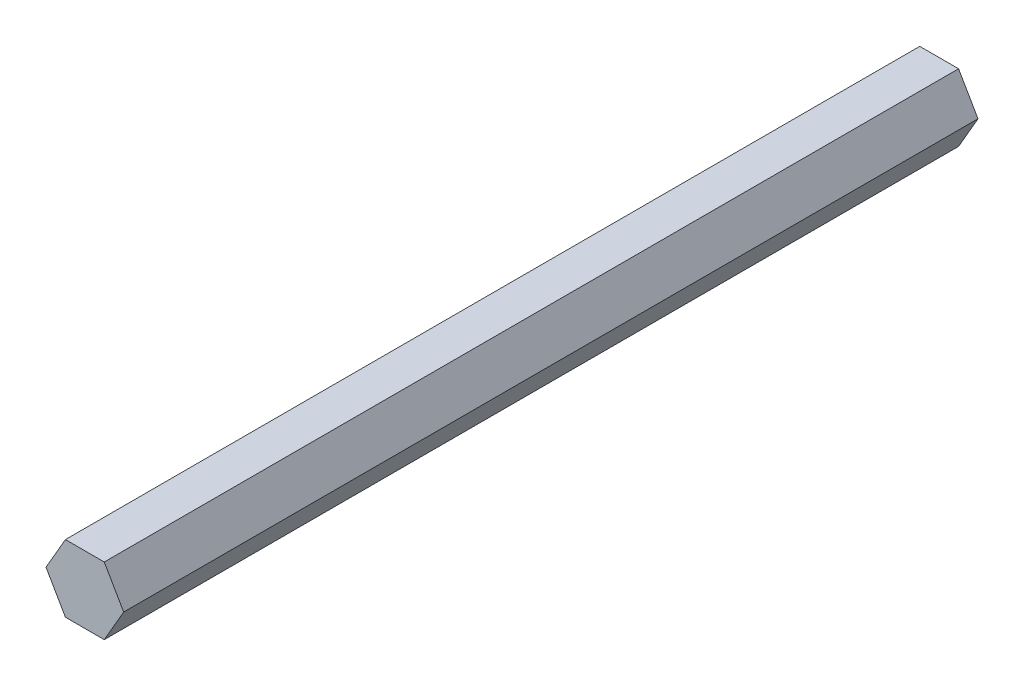
ISO-10303-21;
HEADER;
FILE_DESCRIPTION(('STEP AP214'),'2;1');
FILE_NAME('part.step','',(''),(''),'','','');
FILE_SCHEMA(('AUTOMOTIVE_DESIGN { 1 0 10303 214 1 1 1 1 }'));
ENDSEC;
DATA;
#1=APPLICATION_CONTEXT('core data for automotive mechanical design processes');
#2=APPLICATION_PROTOCOL_DEFINITION('international standard','automotive_design',2000,#1);
#3=PRODUCT_CONTEXT('',#1,'mechanical');
#4=PRODUCT('Part','Part','',(#3));
#5=PRODUCT_RELATED_PRODUCT_CATEGORY('part','',(#4));
#6=PRODUCT_DEFINITION_FORMATION('','',#4);
#7=PRODUCT_DEFINITION_CONTEXT('part definition',#1,'design');
#8=PRODUCT_DEFINITION('design','',#6,#7);
#9=PRODUCT_DEFINITION_SHAPE('','',#8);
#10=(LENGTH_UNIT() NAMED_UNIT(*) SI_UNIT(.MILLI.,.METRE.));
#11=(NAMED_UNIT(*) PLANE_ANGLE_UNIT() SI_UNIT($,.RADIAN.));
#12=(NAMED_UNIT(*) SI_UNIT($,.STERADIAN.) SOLID_ANGLE_UNIT());
#13=UNCERTAINTY_MEASURE_WITH_UNIT(LENGTH_MEASURE(1.E-05),#10,'distance_accuracy_value','');
#14=(GEOMETRIC_REPRESENTATION_CONTEXT(3) GLOBAL_UNCERTAINTY_ASSIGNED_CONTEXT((#13)) GLOBAL_UNIT_ASSIGNED_CONTEXT((#10,
#11,#12)) REPRESENTATION_CONTEXT('',''));
#15=CARTESIAN_POINT('',(0.,0.,0.));
#16=DIRECTION('',(0.,0.,1.));
#17=DIRECTION('',(1.,0.,0.));
#18=AXIS2_PLACEMENT_3D('',#15,#16,#17);
#19=CARTESIAN_POINT('',(0.866025403784457,-1.49999999999999,38.1));
#20=DIRECTION('',(-0.866025403784442,0.499999999999995,0.));
#21=DIRECTION('',(-0.499999999999995,-0.866025403784442,0.));
#22=AXIS2_PLACEMENT_3D('',#19,#20,#21);
#23=PLANE('',#22);
#24=DIRECTION('',(0.499999999999995,0.866025403784441,0.));
#25=VECTOR('',#24,1.);
#26=CARTESIAN_POINT('',(0.866025403784457,-1.49999999999999,0.));
#27=LINE('',#26,#25);
#28=CARTESIAN_POINT('',(0.866025403784457,-1.49999999999999,0.));
#29=VERTEX_POINT('',#28);
#30=CARTESIAN_POINT('',(1.73205080756888,0.,0.));
#31=VERTEX_POINT('',#30);
#32=EDGE_CURVE('E119',#29,#31,#27,.T.);
#33=ORIENTED_EDGE('',*,*,#32,.T.);
#34=DIRECTION('',(0.,0.,-1.));
#35=VECTOR('',#34,1.);
#36=CARTESIAN_POINT('',(1.73205080756888,0.,38.1));
#37=LINE('',#36,#35);
#38=CARTESIAN_POINT('',(1.73205080756888,0.,38.1));
#39=VERTEX_POINT('',#38);
#40=EDGE_CURVE('E11',#39,#31,#37,.T.);
#41=ORIENTED_EDGE('',*,*,#40,.F.);
#42=DIRECTION('',(0.499999999999995,0.866025403784441,0.));
#43=VECTOR('',#42,1.);
#44=CARTESIAN_POINT('',(0.866025403784457,-1.49999999999999,38.1));
#45=LINE('',#44,#43);
#46=CARTESIAN_POINT('',(0.866025403784457,-1.49999999999999,38.1));
#47=VERTEX_POINT('',#46);
#48=EDGE_CURVE('E129',#47,#39,#45,.T.);
#49=ORIENTED_EDGE('',*,*,#48,.F.);
#50=DIRECTION('',(0.,0.,-1.));
#51=VECTOR('',#50,1.);
#52=CARTESIAN_POINT('',(0.866025403784457,-1.49999999999999,38.1));
#53=LINE('',#52,#51);
#54=EDGE_CURVE('E115',#47,#29,#53,.T.);
#55=ORIENTED_EDGE('',*,*,#54,.T.);
#56=EDGE_LOOP('',(#33,#41,#49,#55));
#57=FACE_BOUND('',#56,.T.);
#58=ADVANCED_FACE('F35',(#57),#23,.F.);
#59=CARTESIAN_POINT('',(1.73205080756888,0.,38.1));
#60=DIRECTION('',(-0.866025403784438,-0.500000000000001,0.));
#61=DIRECTION('',(0.500000000000001,-0.866025403784438,0.));
#62=AXIS2_PLACEMENT_3D('',#59,#60,#61);
#63=PLANE('',#62);
#64=DIRECTION('',(-0.500000000000001,0.866025403784438,0.));
#65=VECTOR('',#64,1.);
#66=CARTESIAN_POINT('',(1.73205080756888,0.,0.));
#67=LINE('',#66,#65);
#68=CARTESIAN_POINT('',(0.866025403784436,1.5,0.));
#69=VERTEX_POINT('',#68);
#70=EDGE_CURVE('E122',#31,#69,#67,.T.);
#71=ORIENTED_EDGE('',*,*,#70,.T.);
#72=DIRECTION('',(0.,0.,-1.));
#73=VECTOR('',#72,1.);
#74=CARTESIAN_POINT('',(0.866025403784436,1.5,38.1));
#75=LINE('',#74,#73);
#76=CARTESIAN_POINT('',(0.866025403784436,1.5,38.1));
#77=VERTEX_POINT('',#76);
#78=EDGE_CURVE('E43',#77,#69,#75,.T.);
#79=ORIENTED_EDGE('',*,*,#78,.F.);
#80=DIRECTION('',(-0.500000000000001,0.866025403784438,0.));
#81=VECTOR('',#80,1.);
#82=CARTESIAN_POINT('',(1.73205080756888,0.,38.1));
#83=LINE('',#82,#81);
#84=EDGE_CURVE('E88',#39,#77,#83,.T.);
#85=ORIENTED_EDGE('',*,*,#84,.F.);
#86=ORIENTED_EDGE('',*,*,#40,.T.);
#87=EDGE_LOOP('',(#71,#79,#85,#86));
#88=FACE_BOUND('',#87,.T.);
#89=ADVANCED_FACE('F153',(#88),#63,.F.);
#90=CARTESIAN_POINT('',(0.866025403784436,1.5,38.1));
#91=DIRECTION('',(0.,-1.,0.));
#92=DIRECTION('',(1.,0.,0.));
#93=AXIS2_PLACEMENT_3D('',#90,#91,#92);
#94=PLANE('',#93);
#95=DIRECTION('',(-1.,0.,0.));
#96=VECTOR('',#95,1.);
#97=CARTESIAN_POINT('',(0.866025403784436,1.5,0.));
#98=LINE('',#97,#96);
#99=CARTESIAN_POINT('',(-0.866025403784446,1.5,0.));
#100=VERTEX_POINT('',#99);
#101=EDGE_CURVE('E124',#69,#100,#98,.T.);
#102=ORIENTED_EDGE('',*,*,#101,.T.);
#103=DIRECTION('',(0.,0.,-1.));
#104=VECTOR('',#103,1.);
#105=CARTESIAN_POINT('',(-0.866025403784446,1.5,38.1));
#106=LINE('',#105,#104);
#107=CARTESIAN_POINT('',(-0.866025403784446,1.5,38.1));
#108=VERTEX_POINT('',#107);
#109=EDGE_CURVE('E110',#108,#100,#106,.T.);
#110=ORIENTED_EDGE('',*,*,#109,.F.);
#111=DIRECTION('',(-1.,0.,0.));
#112=VECTOR('',#111,1.);
#113=CARTESIAN_POINT('',(0.866025403784436,1.5,38.1));
#114=LINE('',#113,#112);
#115=EDGE_CURVE('E101',#77,#108,#114,.T.);
#116=ORIENTED_EDGE('',*,*,#115,.F.);
#117=ORIENTED_EDGE('',*,*,#78,.T.);
#118=EDGE_LOOP('',(#102,#110,#116,#117));
#119=FACE_BOUND('',#118,.T.);
#120=ADVANCED_FACE('F135',(#119),#94,.F.);
#121=CARTESIAN_POINT('',(-0.866025403784446,1.5,38.1));
#122=DIRECTION('',(0.866025403784442,-0.499999999999995,0.));
#123=DIRECTION('',(0.499999999999995,0.866025403784442,0.));
#124=AXIS2_PLACEMENT_3D('',#121,#122,#123);
#125=PLANE('',#124);
#126=DIRECTION('',(-0.499999999999995,-0.866025403784442,0.));
#127=VECTOR('',#126,1.);
#128=CARTESIAN_POINT('',(-0.866025403784446,1.5,0.));
#129=LINE('',#128,#127);
#130=CARTESIAN_POINT('',(-1.73205080756888,0.,0.));
#131=VERTEX_POINT('',#130);
#132=EDGE_CURVE('E109',#100,#131,#129,.T.);
#133=ORIENTED_EDGE('',*,*,#132,.T.);
#134=DIRECTION('',(0.,0.,-1.));
#135=VECTOR('',#134,1.);
#136=CARTESIAN_POINT('',(-1.73205080756888,0.,38.1));
#137=LINE('',#136,#135);
#138=CARTESIAN_POINT('',(-1.73205080756888,0.,38.1));
#139=VERTEX_POINT('',#138);
#140=EDGE_CURVE('E106',#139,#131,#137,.T.);
#141=ORIENTED_EDGE('',*,*,#140,.F.);
#142=DIRECTION('',(-0.499999999999995,-0.866025403784442,0.));
#143=VECTOR('',#142,1.);
#144=CARTESIAN_POINT('',(-0.866025403784446,1.5,38.1));
#145=LINE('',#144,#143);
#146=EDGE_CURVE('E95',#108,#139,#145,.T.);
#147=ORIENTED_EDGE('',*,*,#146,.F.);
#148=ORIENTED_EDGE('',*,*,#109,.T.);
#149=EDGE_LOOP('',(#133,#141,#147,#148));
#150=FACE_BOUND('',#149,.T.);
#151=ADVANCED_FACE('F107',(#150),#125,.F.);
#152=CARTESIAN_POINT('',(-1.73205080756888,0.,38.1));
#153=DIRECTION('',(0.866025403784434,0.500000000000007,0.));
#154=DIRECTION('',(-0.500000000000007,0.866025403784435,0.));
#155=AXIS2_PLACEMENT_3D('',#152,#153,#154);
#156=PLANE('',#155);
#157=DIRECTION('',(0.500000000000007,-0.866025403784434,0.));
#158=VECTOR('',#157,1.);
#159=CARTESIAN_POINT('',(-1.73205080756888,0.,0.));
#160=LINE('',#159,#158);
#161=CARTESIAN_POINT('',(-0.866025403784425,-1.50000000000001,0.));
#162=VERTEX_POINT('',#161);
#163=EDGE_CURVE('E74',#131,#162,#160,.T.);
#164=ORIENTED_EDGE('',*,*,#163,.T.);
#165=DIRECTION('',(0.,0.,-1.));
#166=VECTOR('',#165,1.);
#167=CARTESIAN_POINT('',(-0.866025403784425,-1.50000000000001,38.1));
#168=LINE('',#167,#166);
#169=CARTESIAN_POINT('',(-0.866025403784425,-1.50000000000001,38.1));
#170=VERTEX_POINT('',#169);
#171=EDGE_CURVE('E111',#170,#162,#168,.T.);
#172=ORIENTED_EDGE('',*,*,#171,.F.);
#173=DIRECTION('',(0.500000000000007,-0.866025403784434,0.));
#174=VECTOR('',#173,1.);
#175=CARTESIAN_POINT('',(-1.73205080756888,0.,38.1));
#176=LINE('',#175,#174);
#177=EDGE_CURVE('E99',#139,#170,#176,.T.);
#178=ORIENTED_EDGE('',*,*,#177,.F.);
#179=ORIENTED_EDGE('',*,*,#140,.T.);
#180=EDGE_LOOP('',(#164,#172,#178,#179));
#181=FACE_BOUND('',#180,.T.);
#182=ADVANCED_FACE('F113',(#181),#156,.F.);
#183=CARTESIAN_POINT('',(-0.866025403784425,-1.50000000000001,38.1));
#184=DIRECTION('',(0.,1.,0.));
#185=DIRECTION('',(-1.,0.,0.));
#186=AXIS2_PLACEMENT_3D('',#183,#184,#185);
#187=PLANE('',#186);
#188=DIRECTION('',(1.,0.,0.));
#189=VECTOR('',#188,1.);
#190=CARTESIAN_POINT('',(-0.866025403784425,-1.50000000000001,0.));
#191=LINE('',#190,#189);
#192=EDGE_CURVE('E80',#162,#29,#191,.T.);
#193=ORIENTED_EDGE('',*,*,#192,.T.);
#194=ORIENTED_EDGE('',*,*,#54,.F.);
#195=DIRECTION('',(1.,0.,0.));
#196=VECTOR('',#195,1.);
#197=CARTESIAN_POINT('',(-0.866025403784425,-1.50000000000001,38.1));
#198=LINE('',#197,#196);
#199=EDGE_CURVE('E51',#170,#47,#198,.T.);
#200=ORIENTED_EDGE('',*,*,#199,.F.);
#201=ORIENTED_EDGE('',*,*,#171,.T.);
#202=EDGE_LOOP('',(#193,#194,#200,#201));
#203=FACE_BOUND('',#202,.T.);
#204=ADVANCED_FACE('F142',(#203),#187,.F.);
#205=CARTESIAN_POINT('',(0.,0.,38.1));
#206=DIRECTION('',(0.,0.,1.));
#207=DIRECTION('',(1.,0.,0.));
#208=AXIS2_PLACEMENT_3D('',#205,#206,#207);
#209=PLANE('',#208);
#210=ORIENTED_EDGE('',*,*,#48,.T.);
#211=ORIENTED_EDGE('',*,*,#84,.T.);
#212=ORIENTED_EDGE('',*,*,#115,.T.);
#213=ORIENTED_EDGE('',*,*,#146,.T.);
#214=ORIENTED_EDGE('',*,*,#177,.T.);
#215=ORIENTED_EDGE('',*,*,#199,.T.);
#216=EDGE_LOOP('',(#210,#211,#212,#213,#214,#215));
#217=FACE_BOUND('',#216,.T.);
#218=ADVANCED_FACE('F97',(#217),#209,.T.);
#219=CARTESIAN_POINT('',(0.,0.,0.));
#220=DIRECTION('',(0.,0.,1.));
#221=DIRECTION('',(1.,0.,0.));
#222=AXIS2_PLACEMENT_3D('',#219,#220,#221);
#223=PLANE('',#222);
#224=ORIENTED_EDGE('',*,*,#32,.F.);
#225=ORIENTED_EDGE('',*,*,#192,.F.);
#226=ORIENTED_EDGE('',*,*,#163,.F.);
#227=ORIENTED_EDGE('',*,*,#132,.F.);
#228=ORIENTED_EDGE('',*,*,#101,.F.);
#229=ORIENTED_EDGE('',*,*,#70,.F.);
#230=EDGE_LOOP('',(#224,#225,#226,#227,#228,#229));
#231=FACE_BOUND('',#230,.T.);
#232=ADVANCED_FACE('F138',(#231),#223,.F.);
#233=CLOSED_SHELL('',(#58,#89,#120,#151,#182,#204,#218,#232));
#234=MANIFOLD_SOLID_BREP('B2',#233);
#235=ADVANCED_BREP_SHAPE_REPRESENTATION('',(#18,#234),#14);
#236=SHAPE_DEFINITION_REPRESENTATION(#9,#235);
ENDSEC;
END-ISO-10303-21;
